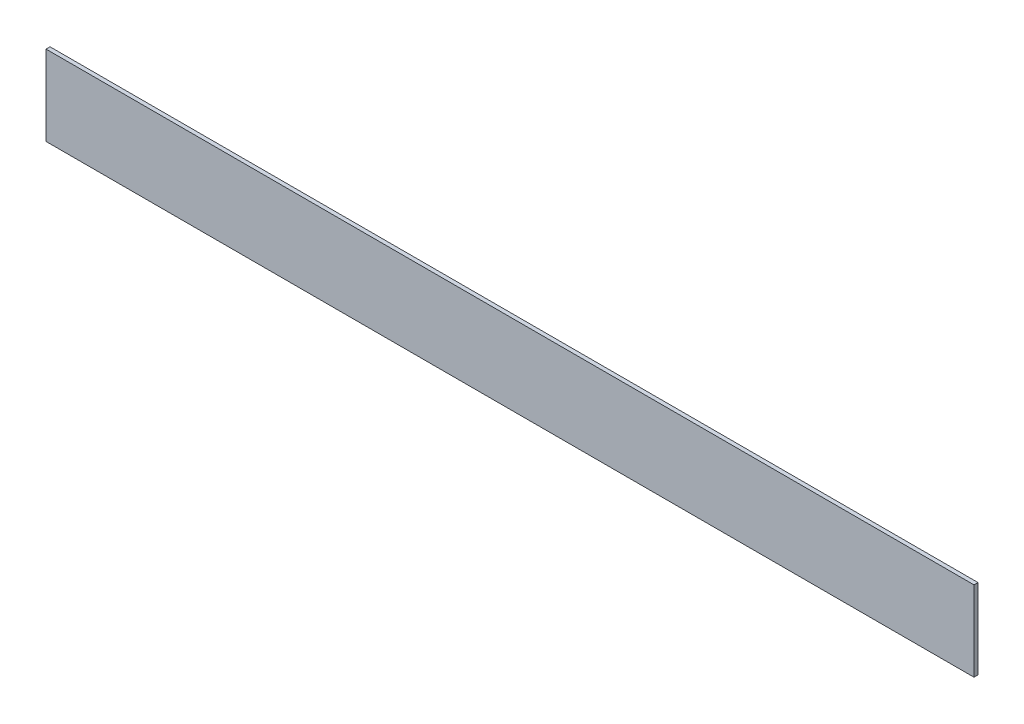
ISO-10303-21;
HEADER;
FILE_DESCRIPTION(('STEP AP214'),'2;1');
FILE_NAME('part.step','',(''),(''),'','','');
FILE_SCHEMA(('AUTOMOTIVE_DESIGN { 1 0 10303 214 1 1 1 1 }'));
ENDSEC;
DATA;
#1=APPLICATION_CONTEXT('core data for automotive mechanical design processes');
#2=APPLICATION_PROTOCOL_DEFINITION('international standard','automotive_design',2000,#1);
#3=PRODUCT_CONTEXT('',#1,'mechanical');
#4=PRODUCT('Part','Part','',(#3));
#5=PRODUCT_RELATED_PRODUCT_CATEGORY('part','',(#4));
#6=PRODUCT_DEFINITION_FORMATION('','',#4);
#7=PRODUCT_DEFINITION_CONTEXT('part definition',#1,'design');
#8=PRODUCT_DEFINITION('design','',#6,#7);
#9=PRODUCT_DEFINITION_SHAPE('','',#8);
#10=(LENGTH_UNIT() NAMED_UNIT(*) SI_UNIT(.MILLI.,.METRE.));
#11=(NAMED_UNIT(*) PLANE_ANGLE_UNIT() SI_UNIT($,.RADIAN.));
#12=(NAMED_UNIT(*) SI_UNIT($,.STERADIAN.) SOLID_ANGLE_UNIT());
#13=UNCERTAINTY_MEASURE_WITH_UNIT(LENGTH_MEASURE(1.E-05),#10,'distance_accuracy_value','');
#14=(GEOMETRIC_REPRESENTATION_CONTEXT(3) GLOBAL_UNCERTAINTY_ASSIGNED_CONTEXT((#13)) GLOBAL_UNIT_ASSIGNED_CONTEXT((#10,
#11,#12)) REPRESENTATION_CONTEXT('',''));
#15=CARTESIAN_POINT('',(0.,0.,0.));
#16=DIRECTION('',(0.,0.,1.));
#17=DIRECTION('',(1.,0.,0.));
#18=AXIS2_PLACEMENT_3D('',#15,#16,#17);
#19=CARTESIAN_POINT('',(-1159.719620525,99.9999999999999,10.));
#20=DIRECTION('',(1.,0.,0.));
#21=DIRECTION('',(0.,0.,-1.));
#22=AXIS2_PLACEMENT_3D('',#19,#20,#21);
#23=PLANE('',#22);
#24=DIRECTION('',(0.,-1.,0.));
#25=VECTOR('',#24,1.);
#26=CARTESIAN_POINT('',(-1159.719620525,99.9999999999999,0.));
#27=LINE('',#26,#25);
#28=CARTESIAN_POINT('',(-1159.719620525,99.9999999999999,0.));
#29=VERTEX_POINT('',#28);
#30=CARTESIAN_POINT('',(-1159.719620525,-100.,0.));
#31=VERTEX_POINT('',#30);
#32=EDGE_CURVE('E95',#29,#31,#27,.T.);
#33=ORIENTED_EDGE('',*,*,#32,.T.);
#34=DIRECTION('',(0.,0.,-1.));
#35=VECTOR('',#34,1.);
#36=CARTESIAN_POINT('',(-1159.719620525,-100.,10.));
#37=LINE('',#36,#35);
#38=CARTESIAN_POINT('',(-1159.719620525,-100.,10.));
#39=VERTEX_POINT('',#38);
#40=EDGE_CURVE('E11',#39,#31,#37,.T.);
#41=ORIENTED_EDGE('',*,*,#40,.F.);
#42=DIRECTION('',(0.,-1.,0.));
#43=VECTOR('',#42,1.);
#44=CARTESIAN_POINT('',(-1159.719620525,99.9999999999999,10.));
#45=LINE('',#44,#43);
#46=CARTESIAN_POINT('',(-1159.719620525,99.9999999999999,10.));
#47=VERTEX_POINT('',#46);
#48=EDGE_CURVE('E83',#47,#39,#45,.T.);
#49=ORIENTED_EDGE('',*,*,#48,.F.);
#50=DIRECTION('',(0.,0.,-1.));
#51=VECTOR('',#50,1.);
#52=CARTESIAN_POINT('',(-1159.719620525,99.9999999999999,10.));
#53=LINE('',#52,#51);
#54=EDGE_CURVE('E91',#47,#29,#53,.T.);
#55=ORIENTED_EDGE('',*,*,#54,.T.);
#56=EDGE_LOOP('',(#33,#41,#49,#55));
#57=FACE_BOUND('',#56,.T.);
#58=ADVANCED_FACE('F32',(#57),#23,.F.);
#59=CARTESIAN_POINT('',(1159.719620525,-99.9999999999999,10.));
#60=DIRECTION('',(0.,1.,0.));
#61=DIRECTION('',(-1.,0.,0.));
#62=AXIS2_PLACEMENT_3D('',#59,#60,#61);
#63=PLANE('',#62);
#64=DIRECTION('',(1.,0.,0.));
#65=VECTOR('',#64,1.);
#66=CARTESIAN_POINT('',(1159.719620525,-99.9999999999999,0.));
#67=LINE('',#66,#65);
#68=CARTESIAN_POINT('',(1159.719620525,-99.9999999999999,0.));
#69=VERTEX_POINT('',#68);
#70=EDGE_CURVE('E87',#31,#69,#67,.T.);
#71=ORIENTED_EDGE('',*,*,#70,.T.);
#72=DIRECTION('',(0.,0.,-1.));
#73=VECTOR('',#72,1.);
#74=CARTESIAN_POINT('',(1159.719620525,-99.9999999999999,10.));
#75=LINE('',#74,#73);
#76=CARTESIAN_POINT('',(1159.719620525,-99.9999999999999,10.));
#77=VERTEX_POINT('',#76);
#78=EDGE_CURVE('E40',#77,#69,#75,.T.);
#79=ORIENTED_EDGE('',*,*,#78,.F.);
#80=DIRECTION('',(1.,0.,0.));
#81=VECTOR('',#80,1.);
#82=CARTESIAN_POINT('',(1159.719620525,-99.9999999999999,10.));
#83=LINE('',#82,#81);
#84=EDGE_CURVE('E78',#39,#77,#83,.T.);
#85=ORIENTED_EDGE('',*,*,#84,.F.);
#86=ORIENTED_EDGE('',*,*,#40,.T.);
#87=EDGE_LOOP('',(#71,#79,#85,#86));
#88=FACE_BOUND('',#87,.T.);
#89=ADVANCED_FACE('F86',(#88),#63,.F.);
#90=CARTESIAN_POINT('',(1159.719620525,100.,10.));
#91=DIRECTION('',(-1.,0.,0.));
#92=DIRECTION('',(0.,0.,1.));
#93=AXIS2_PLACEMENT_3D('',#90,#91,#92);
#94=PLANE('',#93);
#95=DIRECTION('',(0.,1.,0.));
#96=VECTOR('',#95,1.);
#97=CARTESIAN_POINT('',(1159.719620525,100.,0.));
#98=LINE('',#97,#96);
#99=CARTESIAN_POINT('',(1159.719620525,100.,0.));
#100=VERTEX_POINT('',#99);
#101=EDGE_CURVE('E65',#69,#100,#98,.T.);
#102=ORIENTED_EDGE('',*,*,#101,.T.);
#103=DIRECTION('',(0.,0.,-1.));
#104=VECTOR('',#103,1.);
#105=CARTESIAN_POINT('',(1159.719620525,100.,10.));
#106=LINE('',#105,#104);
#107=CARTESIAN_POINT('',(1159.719620525,100.,10.));
#108=VERTEX_POINT('',#107);
#109=EDGE_CURVE('E88',#108,#100,#106,.T.);
#110=ORIENTED_EDGE('',*,*,#109,.F.);
#111=DIRECTION('',(0.,1.,0.));
#112=VECTOR('',#111,1.);
#113=CARTESIAN_POINT('',(1159.719620525,100.,10.));
#114=LINE('',#113,#112);
#115=EDGE_CURVE('E81',#77,#108,#114,.T.);
#116=ORIENTED_EDGE('',*,*,#115,.F.);
#117=ORIENTED_EDGE('',*,*,#78,.T.);
#118=EDGE_LOOP('',(#102,#110,#116,#117));
#119=FACE_BOUND('',#118,.T.);
#120=ADVANCED_FACE('F89',(#119),#94,.F.);
#121=CARTESIAN_POINT('',(1159.719620525,100.,10.));
#122=DIRECTION('',(0.,-1.,0.));
#123=DIRECTION('',(1.,0.,0.));
#124=AXIS2_PLACEMENT_3D('',#121,#122,#123);
#125=PLANE('',#124);
#126=DIRECTION('',(-1.,0.,0.));
#127=VECTOR('',#126,1.);
#128=CARTESIAN_POINT('',(1159.719620525,100.,0.));
#129=LINE('',#128,#127);
#130=EDGE_CURVE('E71',#100,#29,#129,.T.);
#131=ORIENTED_EDGE('',*,*,#130,.T.);
#132=ORIENTED_EDGE('',*,*,#54,.F.);
#133=DIRECTION('',(-1.,0.,0.));
#134=VECTOR('',#133,1.);
#135=CARTESIAN_POINT('',(1159.719620525,100.,10.));
#136=LINE('',#135,#134);
#137=EDGE_CURVE('E48',#108,#47,#136,.T.);
#138=ORIENTED_EDGE('',*,*,#137,.F.);
#139=ORIENTED_EDGE('',*,*,#109,.T.);
#140=EDGE_LOOP('',(#131,#132,#138,#139));
#141=FACE_BOUND('',#140,.T.);
#142=ADVANCED_FACE('F102',(#141),#125,.F.);
#143=CARTESIAN_POINT('',(0.,0.,10.));
#144=DIRECTION('',(0.,0.,-1.));
#145=DIRECTION('',(-1.,0.,0.));
#146=AXIS2_PLACEMENT_3D('',#143,#144,#145);
#147=PLANE('',#146);
#148=ORIENTED_EDGE('',*,*,#48,.T.);
#149=ORIENTED_EDGE('',*,*,#84,.T.);
#150=ORIENTED_EDGE('',*,*,#115,.T.);
#151=ORIENTED_EDGE('',*,*,#137,.T.);
#152=EDGE_LOOP('',(#148,#149,#150,#151));
#153=FACE_BOUND('',#152,.T.);
#154=ADVANCED_FACE('F79',(#153),#147,.F.);
#155=CARTESIAN_POINT('',(0.,0.,0.));
#156=DIRECTION('',(0.,0.,-1.));
#157=DIRECTION('',(-1.,0.,0.));
#158=AXIS2_PLACEMENT_3D('',#155,#156,#157);
#159=PLANE('',#158);
#160=ORIENTED_EDGE('',*,*,#32,.F.);
#161=ORIENTED_EDGE('',*,*,#130,.F.);
#162=ORIENTED_EDGE('',*,*,#101,.F.);
#163=ORIENTED_EDGE('',*,*,#70,.F.);
#164=EDGE_LOOP('',(#160,#161,#162,#163));
#165=FACE_BOUND('',#164,.T.);
#166=ADVANCED_FACE('F105',(#165),#159,.T.);
#167=CLOSED_SHELL('',(#58,#89,#120,#142,#154,#166));
#168=MANIFOLD_SOLID_BREP('B2',#167);
#169=ADVANCED_BREP_SHAPE_REPRESENTATION('',(#18,#168),#14);
#170=SHAPE_DEFINITION_REPRESENTATION(#9,#169);
ENDSEC;
END-ISO-10303-21;
